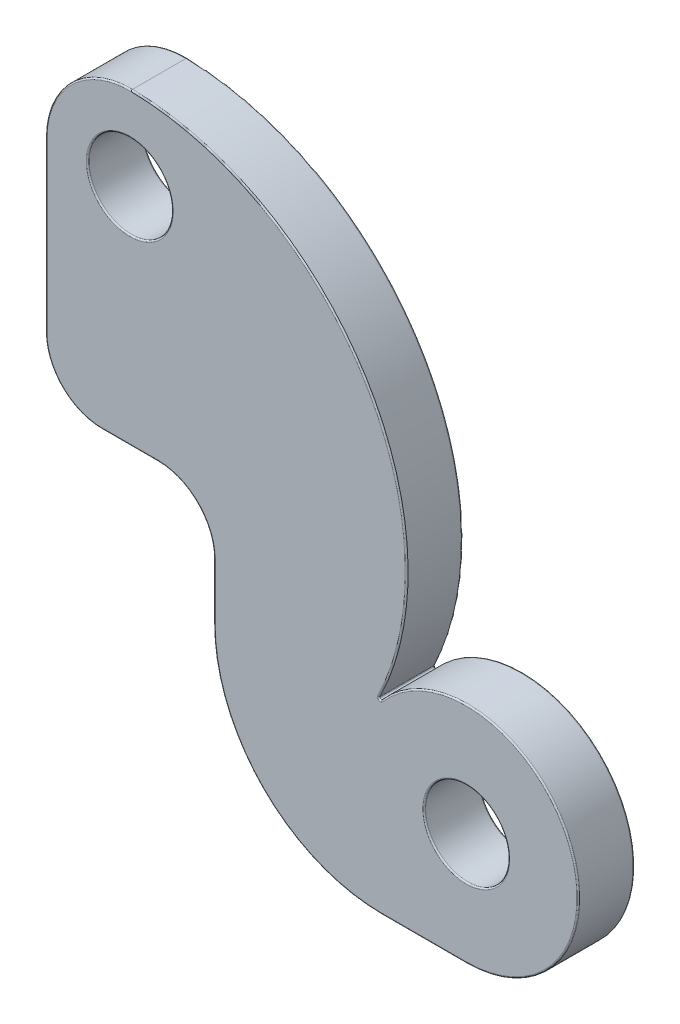
ISO-10303-21;
HEADER;
FILE_DESCRIPTION(('STEP AP214'),'2;1');
FILE_NAME('part.step','',(''),(''),'','','');
FILE_SCHEMA(('AUTOMOTIVE_DESIGN { 1 0 10303 214 1 1 1 1 }'));
ENDSEC;
DATA;
#1=APPLICATION_CONTEXT('core data for automotive mechanical design processes');
#2=APPLICATION_PROTOCOL_DEFINITION('international standard','automotive_design',2000,#1);
#3=PRODUCT_CONTEXT('',#1,'mechanical');
#4=PRODUCT('Part','Part','',(#3));
#5=PRODUCT_RELATED_PRODUCT_CATEGORY('part','',(#4));
#6=PRODUCT_DEFINITION_FORMATION('','',#4);
#7=PRODUCT_DEFINITION_CONTEXT('part definition',#1,'design');
#8=PRODUCT_DEFINITION('design','',#6,#7);
#9=PRODUCT_DEFINITION_SHAPE('','',#8);
#10=(LENGTH_UNIT() NAMED_UNIT(*) SI_UNIT(.MILLI.,.METRE.));
#11=(NAMED_UNIT(*) PLANE_ANGLE_UNIT() SI_UNIT($,.RADIAN.));
#12=(NAMED_UNIT(*) SI_UNIT($,.STERADIAN.) SOLID_ANGLE_UNIT());
#13=UNCERTAINTY_MEASURE_WITH_UNIT(LENGTH_MEASURE(1.E-05),#10,'distance_accuracy_value','');
#14=(GEOMETRIC_REPRESENTATION_CONTEXT(3) GLOBAL_UNCERTAINTY_ASSIGNED_CONTEXT((#13)) GLOBAL_UNIT_ASSIGNED_CONTEXT((#10,
#11,#12)) REPRESENTATION_CONTEXT('',''));
#15=CARTESIAN_POINT('',(0.,0.,0.));
#16=DIRECTION('',(0.,0.,1.));
#17=DIRECTION('',(1.,0.,0.));
#18=AXIS2_PLACEMENT_3D('',#15,#16,#17);
#19=CARTESIAN_POINT('',(0.,0.,10.));
#20=DIRECTION('',(0.,0.,1.));
#21=DIRECTION('',(1.,0.,0.));
#22=AXIS2_PLACEMENT_3D('',#19,#20,#21);
#23=PLANE('',#22);
#24=CARTESIAN_POINT('',(60.,-70.,10.));
#25=DIRECTION('',(0.,0.,1.));
#26=DIRECTION('',(1.,0.,0.));
#27=AXIS2_PLACEMENT_3D('',#24,#25,#26);
#28=CIRCLE('',#27,19.75);
#29=CARTESIAN_POINT('',(60.,-89.75,10.));
#30=VERTEX_POINT('',#29);
#31=CARTESIAN_POINT('',(45.0452681085428,-57.0996707772773,10.));
#32=VERTEX_POINT('',#31);
#33=EDGE_CURVE('E282',#30,#32,#28,.T.);
#34=ORIENTED_EDGE('',*,*,#33,.T.);
#35=CARTESIAN_POINT('',(44.6666673011642,-56.7730801640438,10.));
#36=DIRECTION('',(0.,0.,1.));
#37=DIRECTION('',(1.,0.,0.));
#38=AXIS2_PLACEMENT_3D('',#35,#36,#37);
#39=CIRCLE('',#38,0.5);
#40=CARTESIAN_POINT('',(44.2160674146189,-56.5563781976351,10.));
#41=VERTEX_POINT('',#40);
#42=EDGE_CURVE('E53',#32,#41,#39,.F.);
#43=ORIENTED_EDGE('',*,*,#42,.T.);
#44=CARTESIAN_POINT('',(-0.618621296637138,-34.9945325399747,10.));
#45=DIRECTION('',(0.,0.,1.));
#46=DIRECTION('',(1.,0.,0.));
#47=AXIS2_PLACEMENT_3D('',#44,#45,#46);
#48=CIRCLE('',#47,49.75);
#49=CARTESIAN_POINT('',(0.260704689297082,14.7476958561322,10.));
#50=VERTEX_POINT('',#49);
#51=EDGE_CURVE('E285',#41,#50,#48,.T.);
#52=ORIENTED_EDGE('',*,*,#51,.T.);
#53=CARTESIAN_POINT('',(0.,0.,10.));
#54=DIRECTION('',(0.,0.,1.));
#55=DIRECTION('',(1.,0.,0.));
#56=AXIS2_PLACEMENT_3D('',#53,#54,#55);
#57=CIRCLE('',#56,14.75);
#58=CARTESIAN_POINT('',(-14.75,0.,10.));
#59=VERTEX_POINT('',#58);
#60=EDGE_CURVE('E223',#50,#59,#57,.T.);
#61=ORIENTED_EDGE('',*,*,#60,.T.);
#62=DIRECTION('',(0.,-1.,0.));
#63=VECTOR('',#62,1.);
#64=CARTESIAN_POINT('',(-14.75,-29.9999999999999,10.));
#65=LINE('',#64,#63);
#66=CARTESIAN_POINT('',(-14.75,-29.9999999999999,10.));
#67=VERTEX_POINT('',#66);
#68=EDGE_CURVE('E261',#59,#67,#65,.T.);
#69=ORIENTED_EDGE('',*,*,#68,.T.);
#70=CARTESIAN_POINT('',(-5.,-30.,10.));
#71=DIRECTION('',(0.,0.,1.));
#72=DIRECTION('',(1.,0.,0.));
#73=AXIS2_PLACEMENT_3D('',#70,#71,#72);
#74=CIRCLE('',#73,9.74999999999999);
#75=CARTESIAN_POINT('',(-4.99999999999993,-39.75,10.));
#76=VERTEX_POINT('',#75);
#77=EDGE_CURVE('E264',#67,#76,#74,.T.);
#78=ORIENTED_EDGE('',*,*,#77,.T.);
#79=DIRECTION('',(1.,0.,0.));
#80=VECTOR('',#79,1.);
#81=CARTESIAN_POINT('',(4.99999999999994,-39.75,10.));
#82=LINE('',#81,#80);
#83=CARTESIAN_POINT('',(4.99999999999994,-39.75,10.));
#84=VERTEX_POINT('',#83);
#85=EDGE_CURVE('E267',#76,#84,#82,.T.);
#86=ORIENTED_EDGE('',*,*,#85,.T.);
#87=CARTESIAN_POINT('',(5.00000000000001,-50.,10.));
#88=DIRECTION('',(0.,0.,1.));
#89=DIRECTION('',(1.,0.,0.));
#90=AXIS2_PLACEMENT_3D('',#87,#88,#89);
#91=CIRCLE('',#90,10.25);
#92=CARTESIAN_POINT('',(15.25,-50.0000000000001,10.));
#93=VERTEX_POINT('',#92);
#94=EDGE_CURVE('E270',#84,#93,#91,.F.);
#95=ORIENTED_EDGE('',*,*,#94,.T.);
#96=DIRECTION('',(0.,-1.,0.));
#97=VECTOR('',#96,1.);
#98=CARTESIAN_POINT('',(15.25,-59.9999999999998,10.));
#99=LINE('',#98,#97);
#100=CARTESIAN_POINT('',(15.25,-59.9999999999998,10.));
#101=VERTEX_POINT('',#100);
#102=EDGE_CURVE('E273',#93,#101,#99,.T.);
#103=ORIENTED_EDGE('',*,*,#102,.T.);
#104=CARTESIAN_POINT('',(45.,-60.,10.));
#105=DIRECTION('',(0.,0.,1.));
#106=DIRECTION('',(1.,0.,0.));
#107=AXIS2_PLACEMENT_3D('',#104,#105,#106);
#108=CIRCLE('',#107,29.75);
#109=CARTESIAN_POINT('',(45.0000000000002,-89.75,10.));
#110=VERTEX_POINT('',#109);
#111=EDGE_CURVE('E276',#101,#110,#108,.T.);
#112=ORIENTED_EDGE('',*,*,#111,.T.);
#113=DIRECTION('',(1.,0.,0.));
#114=VECTOR('',#113,1.);
#115=CARTESIAN_POINT('',(60.,-89.75,10.));
#116=LINE('',#115,#114);
#117=EDGE_CURVE('E279',#110,#30,#116,.T.);
#118=ORIENTED_EDGE('',*,*,#117,.T.);
#119=EDGE_LOOP('',(#34,#43,#52,#61,#69,#78,#86,#95,#103,#112,#118));
#120=FACE_BOUND('',#119,.T.);
#121=CARTESIAN_POINT('',(0.,0.,10.));
#122=DIRECTION('',(0.,0.,1.));
#123=DIRECTION('',(1.,0.,0.));
#124=AXIS2_PLACEMENT_3D('',#121,#122,#123);
#125=CIRCLE('',#124,7.75);
#126=CARTESIAN_POINT('',(7.75,0.,10.));
#127=VERTEX_POINT('',#126);
#128=EDGE_CURVE('E255',#127,#127,#125,.F.);
#129=ORIENTED_EDGE('',*,*,#128,.T.);
#130=EDGE_LOOP('',(#129));
#131=FACE_BOUND('',#130,.T.);
#132=CARTESIAN_POINT('',(60.,-70.,10.));
#133=DIRECTION('',(0.,0.,1.));
#134=DIRECTION('',(1.,0.,0.));
#135=AXIS2_PLACEMENT_3D('',#132,#133,#134);
#136=CIRCLE('',#135,7.75);
#137=CARTESIAN_POINT('',(67.75,-70.,10.));
#138=VERTEX_POINT('',#137);
#139=EDGE_CURVE('E251',#138,#138,#136,.F.);
#140=ORIENTED_EDGE('',*,*,#139,.T.);
#141=EDGE_LOOP('',(#140));
#142=FACE_BOUND('',#141,.T.);
#143=ADVANCED_FACE('F43',(#120,#131,#142),#23,.T.);
#144=CARTESIAN_POINT('',(0.,0.,0.));
#145=DIRECTION('',(0.,0.,1.));
#146=DIRECTION('',(1.,0.,0.));
#147=AXIS2_PLACEMENT_3D('',#144,#145,#146);
#148=PLANE('',#147);
#149=CARTESIAN_POINT('',(-0.618621296637138,-34.9945325399747,0.));
#150=DIRECTION('',(0.,0.,1.));
#151=DIRECTION('',(1.,0.,0.));
#152=AXIS2_PLACEMENT_3D('',#149,#150,#151);
#153=CIRCLE('',#152,49.75);
#154=CARTESIAN_POINT('',(0.260704689297082,14.7476958561322,0.));
#155=VERTEX_POINT('',#154);
#156=CARTESIAN_POINT('',(44.2160674146189,-56.5563781976351,0.));
#157=VERTEX_POINT('',#156);
#158=EDGE_CURVE('E366',#155,#157,#153,.F.);
#159=ORIENTED_EDGE('',*,*,#158,.T.);
#160=CARTESIAN_POINT('',(44.6666673011642,-56.7730801640438,0.));
#161=DIRECTION('',(0.,0.,1.));
#162=DIRECTION('',(1.,0.,0.));
#163=AXIS2_PLACEMENT_3D('',#160,#161,#162);
#164=CIRCLE('',#163,0.5);
#165=CARTESIAN_POINT('',(45.0452681085428,-57.0996707772773,0.));
#166=VERTEX_POINT('',#165);
#167=EDGE_CURVE('E11',#157,#166,#164,.T.);
#168=ORIENTED_EDGE('',*,*,#167,.T.);
#169=CARTESIAN_POINT('',(60.,-70.,0.));
#170=DIRECTION('',(0.,0.,1.));
#171=DIRECTION('',(1.,0.,0.));
#172=AXIS2_PLACEMENT_3D('',#169,#170,#171);
#173=CIRCLE('',#172,19.75);
#174=CARTESIAN_POINT('',(60.,-89.75,0.));
#175=VERTEX_POINT('',#174);
#176=EDGE_CURVE('E363',#166,#175,#173,.F.);
#177=ORIENTED_EDGE('',*,*,#176,.T.);
#178=DIRECTION('',(1.,0.,0.));
#179=VECTOR('',#178,1.);
#180=CARTESIAN_POINT('',(0.,-89.75,0.));
#181=LINE('',#180,#179);
#182=CARTESIAN_POINT('',(45.0000000000002,-89.75,0.));
#183=VERTEX_POINT('',#182);
#184=EDGE_CURVE('E360',#175,#183,#181,.F.);
#185=ORIENTED_EDGE('',*,*,#184,.T.);
#186=CARTESIAN_POINT('',(45.,-60.,0.));
#187=DIRECTION('',(0.,0.,1.));
#188=DIRECTION('',(1.,0.,0.));
#189=AXIS2_PLACEMENT_3D('',#186,#187,#188);
#190=CIRCLE('',#189,29.75);
#191=CARTESIAN_POINT('',(15.25,-59.9999999999998,0.));
#192=VERTEX_POINT('',#191);
#193=EDGE_CURVE('E357',#183,#192,#190,.F.);
#194=ORIENTED_EDGE('',*,*,#193,.T.);
#195=DIRECTION('',(0.,-1.,0.));
#196=VECTOR('',#195,1.);
#197=CARTESIAN_POINT('',(15.25,0.,0.));
#198=LINE('',#197,#196);
#199=CARTESIAN_POINT('',(15.25,-50.0000000000001,0.));
#200=VERTEX_POINT('',#199);
#201=EDGE_CURVE('E354',#192,#200,#198,.F.);
#202=ORIENTED_EDGE('',*,*,#201,.T.);
#203=CARTESIAN_POINT('',(5.00000000000001,-50.,0.));
#204=DIRECTION('',(0.,0.,1.));
#205=DIRECTION('',(1.,0.,0.));
#206=AXIS2_PLACEMENT_3D('',#203,#204,#205);
#207=CIRCLE('',#206,10.25);
#208=CARTESIAN_POINT('',(4.99999999999994,-39.75,0.));
#209=VERTEX_POINT('',#208);
#210=EDGE_CURVE('E351',#200,#209,#207,.T.);
#211=ORIENTED_EDGE('',*,*,#210,.T.);
#212=DIRECTION('',(1.,0.,0.));
#213=VECTOR('',#212,1.);
#214=CARTESIAN_POINT('',(0.,-39.75,0.));
#215=LINE('',#214,#213);
#216=CARTESIAN_POINT('',(-4.99999999999993,-39.75,0.));
#217=VERTEX_POINT('',#216);
#218=EDGE_CURVE('E348',#209,#217,#215,.F.);
#219=ORIENTED_EDGE('',*,*,#218,.T.);
#220=CARTESIAN_POINT('',(-5.,-30.,0.));
#221=DIRECTION('',(0.,0.,1.));
#222=DIRECTION('',(1.,0.,0.));
#223=AXIS2_PLACEMENT_3D('',#220,#221,#222);
#224=CIRCLE('',#223,9.74999999999999);
#225=CARTESIAN_POINT('',(-14.75,-29.9999999999999,0.));
#226=VERTEX_POINT('',#225);
#227=EDGE_CURVE('E345',#217,#226,#224,.F.);
#228=ORIENTED_EDGE('',*,*,#227,.T.);
#229=DIRECTION('',(0.,-1.,0.));
#230=VECTOR('',#229,1.);
#231=CARTESIAN_POINT('',(-14.75,0.,0.));
#232=LINE('',#231,#230);
#233=CARTESIAN_POINT('',(-14.75,0.,0.));
#234=VERTEX_POINT('',#233);
#235=EDGE_CURVE('E342',#226,#234,#232,.F.);
#236=ORIENTED_EDGE('',*,*,#235,.T.);
#237=CARTESIAN_POINT('',(0.,0.,0.));
#238=DIRECTION('',(0.,0.,1.));
#239=DIRECTION('',(1.,0.,0.));
#240=AXIS2_PLACEMENT_3D('',#237,#238,#239);
#241=CIRCLE('',#240,14.75);
#242=EDGE_CURVE('E339',#234,#155,#241,.F.);
#243=ORIENTED_EDGE('',*,*,#242,.T.);
#244=EDGE_LOOP('',(#159,#168,#177,#185,#194,#202,#211,#219,#228,#236,#243));
#245=FACE_BOUND('',#244,.T.);
#246=CARTESIAN_POINT('',(0.,0.,0.));
#247=DIRECTION('',(0.,0.,1.));
#248=DIRECTION('',(1.,0.,0.));
#249=AXIS2_PLACEMENT_3D('',#246,#247,#248);
#250=CIRCLE('',#249,7.75);
#251=CARTESIAN_POINT('',(7.75,0.,0.));
#252=VERTEX_POINT('',#251);
#253=EDGE_CURVE('E335',#252,#252,#250,.T.);
#254=ORIENTED_EDGE('',*,*,#253,.T.);
#255=EDGE_LOOP('',(#254));
#256=FACE_BOUND('',#255,.T.);
#257=CARTESIAN_POINT('',(60.,-70.,0.));
#258=DIRECTION('',(0.,0.,1.));
#259=DIRECTION('',(1.,0.,0.));
#260=AXIS2_PLACEMENT_3D('',#257,#258,#259);
#261=CIRCLE('',#260,7.75);
#262=CARTESIAN_POINT('',(67.75,-70.,0.));
#263=VERTEX_POINT('',#262);
#264=EDGE_CURVE('E206',#263,#263,#261,.T.);
#265=ORIENTED_EDGE('',*,*,#264,.T.);
#266=EDGE_LOOP('',(#265));
#267=FACE_BOUND('',#266,.T.);
#268=ADVANCED_FACE('F614',(#245,#256,#267),#148,.F.);
#269=CARTESIAN_POINT('',(0.,0.,10.));
#270=DIRECTION('',(0.,0.,-1.));
#271=DIRECTION('',(-1.,0.,0.));
#272=AXIS2_PLACEMENT_3D('',#269,#270,#271);
#273=CYLINDRICAL_SURFACE('',#272,15.);
#274=DIRECTION('',(0.,0.,-1.));
#275=VECTOR('',#274,1.);
#276=CARTESIAN_POINT('',(-15.,0.,10.));
#277=LINE('',#276,#275);
#278=CARTESIAN_POINT('',(-15.,0.,9.75));
#279=VERTEX_POINT('',#278);
#280=CARTESIAN_POINT('',(-15.,0.,0.25));
#281=VERTEX_POINT('',#280);
#282=EDGE_CURVE('E200',#279,#281,#277,.T.);
#283=ORIENTED_EDGE('',*,*,#282,.F.);
#284=CARTESIAN_POINT('',(0.,0.,9.75));
#285=DIRECTION('',(0.,0.,1.));
#286=DIRECTION('',(1.,0.,0.));
#287=AXIS2_PLACEMENT_3D('',#284,#285,#286);
#288=CIRCLE('',#287,15.);
#289=CARTESIAN_POINT('',(0.26512341284449,14.9976568028463,9.75));
#290=VERTEX_POINT('',#289);
#291=EDGE_CURVE('E194',#279,#290,#288,.F.);
#292=ORIENTED_EDGE('',*,*,#291,.T.);
#293=DIRECTION('',(0.,0.,-1.));
#294=VECTOR('',#293,1.);
#295=CARTESIAN_POINT('',(0.26512341284449,14.9976568028463,10.));
#296=LINE('',#295,#294);
#297=CARTESIAN_POINT('',(0.26512341284449,14.9976568028463,0.25));
#298=VERTEX_POINT('',#297);
#299=EDGE_CURVE('E197',#290,#298,#296,.T.);
#300=ORIENTED_EDGE('',*,*,#299,.T.);
#301=CARTESIAN_POINT('',(0.,0.,0.25));
#302=DIRECTION('',(0.,0.,1.));
#303=DIRECTION('',(1.,0.,0.));
#304=AXIS2_PLACEMENT_3D('',#301,#302,#303);
#305=CIRCLE('',#304,15.);
#306=EDGE_CURVE('E207',#298,#281,#305,.T.);
#307=ORIENTED_EDGE('',*,*,#306,.T.);
#308=EDGE_LOOP('',(#283,#292,#300,#307));
#309=FACE_BOUND('',#308,.T.);
#310=ADVANCED_FACE('F196',(#309),#273,.T.);
#311=CARTESIAN_POINT('',(-15.,0.,10.));
#312=DIRECTION('',(1.,0.,0.));
#313=DIRECTION('',(0.,1.,0.));
#314=AXIS2_PLACEMENT_3D('',#311,#312,#313);
#315=PLANE('',#314);
#316=DIRECTION('',(0.,0.,-1.));
#317=VECTOR('',#316,1.);
#318=CARTESIAN_POINT('',(-15.,-29.9999999999999,10.));
#319=LINE('',#318,#317);
#320=CARTESIAN_POINT('',(-15.,-29.9999999999999,9.75));
#321=VERTEX_POINT('',#320);
#322=CARTESIAN_POINT('',(-15.,-29.9999999999999,0.25));
#323=VERTEX_POINT('',#322);
#324=EDGE_CURVE('E500',#321,#323,#319,.T.);
#325=ORIENTED_EDGE('',*,*,#324,.F.);
#326=DIRECTION('',(0.,-1.,0.));
#327=VECTOR('',#326,1.);
#328=CARTESIAN_POINT('',(-15.,0.,9.75));
#329=LINE('',#328,#327);
#330=EDGE_CURVE('E327',#321,#279,#329,.F.);
#331=ORIENTED_EDGE('',*,*,#330,.T.);
#332=ORIENTED_EDGE('',*,*,#282,.T.);
#333=DIRECTION('',(0.,-1.,0.));
#334=VECTOR('',#333,1.);
#335=CARTESIAN_POINT('',(-15.,0.,0.25));
#336=LINE('',#335,#334);
#337=EDGE_CURVE('E324',#281,#323,#336,.T.);
#338=ORIENTED_EDGE('',*,*,#337,.T.);
#339=EDGE_LOOP('',(#325,#331,#332,#338));
#340=FACE_BOUND('',#339,.T.);
#341=ADVANCED_FACE('F497',(#340),#315,.F.);
#342=CARTESIAN_POINT('',(-5.,-30.,10.));
#343=DIRECTION('',(0.,0.,-1.));
#344=DIRECTION('',(-1.,0.,0.));
#345=AXIS2_PLACEMENT_3D('',#342,#343,#344);
#346=CYLINDRICAL_SURFACE('',#345,9.99999999999999);
#347=DIRECTION('',(0.,0.,-1.));
#348=VECTOR('',#347,1.);
#349=CARTESIAN_POINT('',(-4.99999999999993,-40.,10.));
#350=LINE('',#349,#348);
#351=CARTESIAN_POINT('',(-4.99999999999993,-40.,9.75));
#352=VERTEX_POINT('',#351);
#353=CARTESIAN_POINT('',(-4.99999999999993,-40.,0.25));
#354=VERTEX_POINT('',#353);
#355=EDGE_CURVE('E504',#352,#354,#350,.T.);
#356=ORIENTED_EDGE('',*,*,#355,.F.);
#357=CARTESIAN_POINT('',(-5.,-30.,9.75));
#358=DIRECTION('',(0.,0.,1.));
#359=DIRECTION('',(1.,0.,0.));
#360=AXIS2_PLACEMENT_3D('',#357,#358,#359);
#361=CIRCLE('',#360,9.99999999999999);
#362=EDGE_CURVE('E321',#352,#321,#361,.F.);
#363=ORIENTED_EDGE('',*,*,#362,.T.);
#364=ORIENTED_EDGE('',*,*,#324,.T.);
#365=CARTESIAN_POINT('',(-5.,-30.,0.25));
#366=DIRECTION('',(0.,0.,1.));
#367=DIRECTION('',(1.,0.,0.));
#368=AXIS2_PLACEMENT_3D('',#365,#366,#367);
#369=CIRCLE('',#368,9.99999999999999);
#370=EDGE_CURVE('E318',#323,#354,#369,.T.);
#371=ORIENTED_EDGE('',*,*,#370,.T.);
#372=EDGE_LOOP('',(#356,#363,#364,#371));
#373=FACE_BOUND('',#372,.T.);
#374=ADVANCED_FACE('F569',(#373),#346,.T.);
#375=CARTESIAN_POINT('',(-4.99999999999993,-40.,10.));
#376=DIRECTION('',(0.,1.,0.));
#377=DIRECTION('',(0.,0.,1.));
#378=AXIS2_PLACEMENT_3D('',#375,#376,#377);
#379=PLANE('',#378);
#380=DIRECTION('',(0.,0.,-1.));
#381=VECTOR('',#380,1.);
#382=CARTESIAN_POINT('',(4.99999999999994,-40.,10.));
#383=LINE('',#382,#381);
#384=CARTESIAN_POINT('',(4.99999999999994,-40.,9.75));
#385=VERTEX_POINT('',#384);
#386=CARTESIAN_POINT('',(4.99999999999994,-40.,0.25));
#387=VERTEX_POINT('',#386);
#388=EDGE_CURVE('E510',#385,#387,#383,.T.);
#389=ORIENTED_EDGE('',*,*,#388,.F.);
#390=DIRECTION('',(1.,0.,0.));
#391=VECTOR('',#390,1.);
#392=CARTESIAN_POINT('',(-4.99999999999993,-40.,9.75));
#393=LINE('',#392,#391);
#394=EDGE_CURVE('E315',#385,#352,#393,.F.);
#395=ORIENTED_EDGE('',*,*,#394,.T.);
#396=ORIENTED_EDGE('',*,*,#355,.T.);
#397=DIRECTION('',(1.,0.,0.));
#398=VECTOR('',#397,1.);
#399=CARTESIAN_POINT('',(-4.99999999999993,-40.,0.25));
#400=LINE('',#399,#398);
#401=EDGE_CURVE('E312',#354,#387,#400,.T.);
#402=ORIENTED_EDGE('',*,*,#401,.T.);
#403=EDGE_LOOP('',(#389,#395,#396,#402));
#404=FACE_BOUND('',#403,.T.);
#405=ADVANCED_FACE('F573',(#404),#379,.F.);
#406=CARTESIAN_POINT('',(5.00000000000001,-50.,10.));
#407=DIRECTION('',(0.,0.,-1.));
#408=DIRECTION('',(-1.,0.,0.));
#409=AXIS2_PLACEMENT_3D('',#406,#407,#408);
#410=CYLINDRICAL_SURFACE('',#409,9.99999999999999);
#411=DIRECTION('',(0.,0.,-1.));
#412=VECTOR('',#411,1.);
#413=CARTESIAN_POINT('',(15.,-50.0000000000001,10.));
#414=LINE('',#413,#412);
#415=CARTESIAN_POINT('',(15.,-50.0000000000001,9.75));
#416=VERTEX_POINT('',#415);
#417=CARTESIAN_POINT('',(15.,-50.0000000000001,0.25));
#418=VERTEX_POINT('',#417);
#419=EDGE_CURVE('E517',#416,#418,#414,.T.);
#420=ORIENTED_EDGE('',*,*,#419,.F.);
#421=CARTESIAN_POINT('',(5.00000000000001,-50.,9.75));
#422=DIRECTION('',(0.,0.,1.));
#423=DIRECTION('',(1.,0.,0.));
#424=AXIS2_PLACEMENT_3D('',#421,#422,#423);
#425=CIRCLE('',#424,9.99999999999999);
#426=EDGE_CURVE('E309',#416,#385,#425,.T.);
#427=ORIENTED_EDGE('',*,*,#426,.T.);
#428=ORIENTED_EDGE('',*,*,#388,.T.);
#429=CARTESIAN_POINT('',(5.00000000000001,-50.,0.25));
#430=DIRECTION('',(0.,0.,1.));
#431=DIRECTION('',(1.,0.,0.));
#432=AXIS2_PLACEMENT_3D('',#429,#430,#431);
#433=CIRCLE('',#432,9.99999999999999);
#434=EDGE_CURVE('E306',#387,#418,#433,.F.);
#435=ORIENTED_EDGE('',*,*,#434,.T.);
#436=EDGE_LOOP('',(#420,#427,#428,#435));
#437=FACE_BOUND('',#436,.T.);
#438=ADVANCED_FACE('F582',(#437),#410,.F.);
#439=CARTESIAN_POINT('',(15.,-50.0000000000001,10.));
#440=DIRECTION('',(1.,0.,0.));
#441=DIRECTION('',(0.,1.,0.));
#442=AXIS2_PLACEMENT_3D('',#439,#440,#441);
#443=PLANE('',#442);
#444=DIRECTION('',(0.,0.,-1.));
#445=VECTOR('',#444,1.);
#446=CARTESIAN_POINT('',(15.,-59.9999999999998,10.));
#447=LINE('',#446,#445);
#448=CARTESIAN_POINT('',(15.,-59.9999999999998,9.75));
#449=VERTEX_POINT('',#448);
#450=CARTESIAN_POINT('',(15.,-59.9999999999998,0.25));
#451=VERTEX_POINT('',#450);
#452=EDGE_CURVE('E521',#449,#451,#447,.T.);
#453=ORIENTED_EDGE('',*,*,#452,.F.);
#454=DIRECTION('',(0.,-1.,0.));
#455=VECTOR('',#454,1.);
#456=CARTESIAN_POINT('',(15.,-50.0000000000001,9.75));
#457=LINE('',#456,#455);
#458=EDGE_CURVE('E303',#449,#416,#457,.F.);
#459=ORIENTED_EDGE('',*,*,#458,.T.);
#460=ORIENTED_EDGE('',*,*,#419,.T.);
#461=DIRECTION('',(0.,-1.,0.));
#462=VECTOR('',#461,1.);
#463=CARTESIAN_POINT('',(15.,-50.0000000000001,0.25));
#464=LINE('',#463,#462);
#465=EDGE_CURVE('E300',#418,#451,#464,.T.);
#466=ORIENTED_EDGE('',*,*,#465,.T.);
#467=EDGE_LOOP('',(#453,#459,#460,#466));
#468=FACE_BOUND('',#467,.T.);
#469=ADVANCED_FACE('F585',(#468),#443,.F.);
#470=CARTESIAN_POINT('',(45.,-60.,10.));
#471=DIRECTION('',(0.,0.,-1.));
#472=DIRECTION('',(-1.,0.,0.));
#473=AXIS2_PLACEMENT_3D('',#470,#471,#472);
#474=CYLINDRICAL_SURFACE('',#473,30.);
#475=DIRECTION('',(0.,0.,-1.));
#476=VECTOR('',#475,1.);
#477=CARTESIAN_POINT('',(45.0000000000002,-90.,10.));
#478=LINE('',#477,#476);
#479=CARTESIAN_POINT('',(45.0000000000002,-90.,9.75));
#480=VERTEX_POINT('',#479);
#481=CARTESIAN_POINT('',(45.0000000000002,-90.,0.25));
#482=VERTEX_POINT('',#481);
#483=EDGE_CURVE('E525',#480,#482,#478,.T.);
#484=ORIENTED_EDGE('',*,*,#483,.F.);
#485=CARTESIAN_POINT('',(45.,-60.,9.75));
#486=DIRECTION('',(0.,0.,1.));
#487=DIRECTION('',(1.,0.,0.));
#488=AXIS2_PLACEMENT_3D('',#485,#486,#487);
#489=CIRCLE('',#488,30.);
#490=EDGE_CURVE('E297',#480,#449,#489,.F.);
#491=ORIENTED_EDGE('',*,*,#490,.T.);
#492=ORIENTED_EDGE('',*,*,#452,.T.);
#493=CARTESIAN_POINT('',(45.,-60.,0.25));
#494=DIRECTION('',(0.,0.,1.));
#495=DIRECTION('',(1.,0.,0.));
#496=AXIS2_PLACEMENT_3D('',#493,#494,#495);
#497=CIRCLE('',#496,30.);
#498=EDGE_CURVE('E294',#451,#482,#497,.T.);
#499=ORIENTED_EDGE('',*,*,#498,.T.);
#500=EDGE_LOOP('',(#484,#491,#492,#499));
#501=FACE_BOUND('',#500,.T.);
#502=ADVANCED_FACE('F631',(#501),#474,.T.);
#503=CARTESIAN_POINT('',(45.0000000000002,-90.,10.));
#504=DIRECTION('',(0.,1.,0.));
#505=DIRECTION('',(0.,0.,1.));
#506=AXIS2_PLACEMENT_3D('',#503,#504,#505);
#507=PLANE('',#506);
#508=DIRECTION('',(0.,0.,-1.));
#509=VECTOR('',#508,1.);
#510=CARTESIAN_POINT('',(60.,-90.,10.));
#511=LINE('',#510,#509);
#512=CARTESIAN_POINT('',(60.,-90.,9.75));
#513=VERTEX_POINT('',#512);
#514=CARTESIAN_POINT('',(60.,-90.,0.25));
#515=VERTEX_POINT('',#514);
#516=EDGE_CURVE('E218',#513,#515,#511,.T.);
#517=ORIENTED_EDGE('',*,*,#516,.F.);
#518=DIRECTION('',(1.,0.,0.));
#519=VECTOR('',#518,1.);
#520=CARTESIAN_POINT('',(45.0000000000002,-90.,9.75));
#521=LINE('',#520,#519);
#522=EDGE_CURVE('E291',#513,#480,#521,.F.);
#523=ORIENTED_EDGE('',*,*,#522,.T.);
#524=ORIENTED_EDGE('',*,*,#483,.T.);
#525=DIRECTION('',(1.,0.,0.));
#526=VECTOR('',#525,1.);
#527=CARTESIAN_POINT('',(45.0000000000002,-90.,0.25));
#528=LINE('',#527,#526);
#529=EDGE_CURVE('E288',#482,#515,#528,.T.);
#530=ORIENTED_EDGE('',*,*,#529,.T.);
#531=EDGE_LOOP('',(#517,#523,#524,#530));
#532=FACE_BOUND('',#531,.T.);
#533=ADVANCED_FACE('F628',(#532),#507,.F.);
#534=CARTESIAN_POINT('',(60.,-70.,10.));
#535=DIRECTION('',(0.,0.,-1.));
#536=DIRECTION('',(-1.,0.,0.));
#537=AXIS2_PLACEMENT_3D('',#534,#535,#536);
#538=CYLINDRICAL_SURFACE('',#537,20.);
#539=DIRECTION('',(0.,0.,-1.));
#540=VECTOR('',#539,1.);
#541=CARTESIAN_POINT('',(44.8559677048535,-56.9363754706605,10.));
#542=LINE('',#541,#540);
#543=CARTESIAN_POINT('',(44.8559677048535,-56.9363754706605,0.25));
#544=VERTEX_POINT('',#543);
#545=CARTESIAN_POINT('',(44.8559677048535,-56.9363754706605,9.75));
#546=VERTEX_POINT('',#545);
#547=EDGE_CURVE('E241',#544,#546,#542,.F.);
#548=ORIENTED_EDGE('',*,*,#547,.T.);
#549=CARTESIAN_POINT('',(60.,-70.,9.75));
#550=DIRECTION('',(0.,0.,1.));
#551=DIRECTION('',(1.,0.,0.));
#552=AXIS2_PLACEMENT_3D('',#549,#550,#551);
#553=CIRCLE('',#552,20.);
#554=EDGE_CURVE('E248',#546,#513,#553,.F.);
#555=ORIENTED_EDGE('',*,*,#554,.T.);
#556=ORIENTED_EDGE('',*,*,#516,.T.);
#557=CARTESIAN_POINT('',(60.,-70.,0.25));
#558=DIRECTION('',(0.,0.,1.));
#559=DIRECTION('',(1.,0.,0.));
#560=AXIS2_PLACEMENT_3D('',#557,#558,#559);
#561=CIRCLE('',#560,20.);
#562=EDGE_CURVE('E236',#515,#544,#561,.T.);
#563=ORIENTED_EDGE('',*,*,#562,.T.);
#564=EDGE_LOOP('',(#548,#555,#556,#563));
#565=FACE_BOUND('',#564,.T.);
#566=ADVANCED_FACE('F534',(#565),#538,.T.);
#567=CARTESIAN_POINT('',(-0.618621296637138,-34.9945325399747,10.));
#568=DIRECTION('',(0.,0.,-1.));
#569=DIRECTION('',(-1.,0.,0.));
#570=AXIS2_PLACEMENT_3D('',#567,#568,#569);
#571=CYLINDRICAL_SURFACE('',#570,50.);
#572=ORIENTED_EDGE('',*,*,#299,.F.);
#573=CARTESIAN_POINT('',(-0.618621296637138,-34.9945325399747,9.75));
#574=DIRECTION('',(0.,0.,1.));
#575=DIRECTION('',(1.,0.,0.));
#576=AXIS2_PLACEMENT_3D('',#573,#574,#575);
#577=CIRCLE('',#576,50.);
#578=CARTESIAN_POINT('',(44.4413673578915,-56.6647291808395,9.75));
#579=VERTEX_POINT('',#578);
#580=EDGE_CURVE('E213',#290,#579,#577,.F.);
#581=ORIENTED_EDGE('',*,*,#580,.T.);
#582=DIRECTION('',(0.,0.,-1.));
#583=VECTOR('',#582,1.);
#584=CARTESIAN_POINT('',(44.4413673578915,-56.6647291808395,10.));
#585=LINE('',#584,#583);
#586=CARTESIAN_POINT('',(44.4413673578915,-56.6647291808395,0.25));
#587=VERTEX_POINT('',#586);
#588=EDGE_CURVE('E237',#579,#587,#585,.T.);
#589=ORIENTED_EDGE('',*,*,#588,.T.);
#590=CARTESIAN_POINT('',(-0.618621296637138,-34.9945325399747,0.25));
#591=DIRECTION('',(0.,0.,1.));
#592=DIRECTION('',(1.,0.,0.));
#593=AXIS2_PLACEMENT_3D('',#590,#591,#592);
#594=CIRCLE('',#593,50.);
#595=EDGE_CURVE('E216',#587,#298,#594,.T.);
#596=ORIENTED_EDGE('',*,*,#595,.T.);
#597=EDGE_LOOP('',(#572,#581,#589,#596));
#598=FACE_BOUND('',#597,.T.);
#599=ADVANCED_FACE('F210',(#598),#571,.T.);
#600=CARTESIAN_POINT('',(0.,0.,10.));
#601=DIRECTION('',(0.,0.,-1.));
#602=DIRECTION('',(-1.,0.,0.));
#603=AXIS2_PLACEMENT_3D('',#600,#601,#602);
#604=CYLINDRICAL_SURFACE('',#603,7.5);
#605=CARTESIAN_POINT('',(0.,0.,9.75));
#606=DIRECTION('',(0.,0.,1.));
#607=DIRECTION('',(1.,0.,0.));
#608=AXIS2_PLACEMENT_3D('',#605,#606,#607);
#609=CIRCLE('',#608,7.5);
#610=CARTESIAN_POINT('',(7.5,0.,9.75));
#611=VERTEX_POINT('',#610);
#612=EDGE_CURVE('E373',#611,#611,#609,.T.);
#613=ORIENTED_EDGE('',*,*,#612,.T.);
#614=EDGE_LOOP('',(#613));
#615=FACE_BOUND('',#614,.T.);
#616=CARTESIAN_POINT('',(0.,0.,0.25));
#617=DIRECTION('',(0.,0.,1.));
#618=DIRECTION('',(1.,0.,0.));
#619=AXIS2_PLACEMENT_3D('',#616,#617,#618);
#620=CIRCLE('',#619,7.5);
#621=CARTESIAN_POINT('',(7.5,0.,0.25));
#622=VERTEX_POINT('',#621);
#623=EDGE_CURVE('E369',#622,#622,#620,.F.);
#624=ORIENTED_EDGE('',*,*,#623,.T.);
#625=EDGE_LOOP('',(#624));
#626=FACE_BOUND('',#625,.T.);
#627=ADVANCED_FACE('F621',(#615,#626),#604,.F.);
#628=CARTESIAN_POINT('',(60.,-70.,10.));
#629=DIRECTION('',(0.,0.,-1.));
#630=DIRECTION('',(-1.,0.,0.));
#631=AXIS2_PLACEMENT_3D('',#628,#629,#630);
#632=CYLINDRICAL_SURFACE('',#631,7.5);
#633=CARTESIAN_POINT('',(60.,-70.,9.75));
#634=DIRECTION('',(0.,0.,1.));
#635=DIRECTION('',(1.,0.,0.));
#636=AXIS2_PLACEMENT_3D('',#633,#634,#635);
#637=CIRCLE('',#636,7.5);
#638=CARTESIAN_POINT('',(67.5,-70.,9.75));
#639=VERTEX_POINT('',#638);
#640=EDGE_CURVE('E381',#639,#639,#637,.T.);
#641=ORIENTED_EDGE('',*,*,#640,.T.);
#642=EDGE_LOOP('',(#641));
#643=FACE_BOUND('',#642,.T.);
#644=CARTESIAN_POINT('',(60.,-70.,0.25));
#645=DIRECTION('',(0.,0.,1.));
#646=DIRECTION('',(1.,0.,0.));
#647=AXIS2_PLACEMENT_3D('',#644,#645,#646);
#648=CIRCLE('',#647,7.5);
#649=CARTESIAN_POINT('',(67.5,-70.,0.25));
#650=VERTEX_POINT('',#649);
#651=EDGE_CURVE('E377',#650,#650,#648,.F.);
#652=ORIENTED_EDGE('',*,*,#651,.T.);
#653=EDGE_LOOP('',(#652));
#654=FACE_BOUND('',#653,.T.);
#655=ADVANCED_FACE('F675',(#643,#654),#632,.F.);
#656=CARTESIAN_POINT('',(5.00000000000001,-50.,9.75));
#657=DIRECTION('',(0.,0.,1.));
#658=DIRECTION('',(1.,0.,0.));
#659=AXIS2_PLACEMENT_3D('',#656,#657,#658);
#660=TOROIDAL_SURFACE('',#659,10.25,0.25);
#661=CARTESIAN_POINT('',(15.25,-50.0000000000001,9.75));
#662=DIRECTION('',(0.,-1.,0.));
#663=DIRECTION('',(0.,0.,-1.));
#664=AXIS2_PLACEMENT_3D('',#661,#662,#663);
#665=CIRCLE('',#664,0.25);
#666=EDGE_CURVE('E459',#93,#416,#665,.T.);
#667=ORIENTED_EDGE('',*,*,#666,.F.);
#668=ORIENTED_EDGE('',*,*,#94,.F.);
#669=CARTESIAN_POINT('',(4.99999999999994,-39.75,9.75));
#670=DIRECTION('',(-1.,0.,0.));
#671=DIRECTION('',(0.,-1.,0.));
#672=AXIS2_PLACEMENT_3D('',#669,#670,#671);
#673=CIRCLE('',#672,0.25);
#674=EDGE_CURVE('E47',#385,#84,#673,.T.);
#675=ORIENTED_EDGE('',*,*,#674,.F.);
#676=ORIENTED_EDGE('',*,*,#426,.F.);
#677=EDGE_LOOP('',(#667,#668,#675,#676));
#678=FACE_BOUND('',#677,.T.);
#679=ADVANCED_FACE('F481',(#678),#660,.T.);
#680=CARTESIAN_POINT('',(0.,-39.75,9.75));
#681=DIRECTION('',(-1.,0.,0.));
#682=DIRECTION('',(0.,0.,1.));
#683=AXIS2_PLACEMENT_3D('',#680,#681,#682);
#684=CYLINDRICAL_SURFACE('',#683,0.25);
#685=ORIENTED_EDGE('',*,*,#674,.T.);
#686=ORIENTED_EDGE('',*,*,#85,.F.);
#687=CARTESIAN_POINT('',(-4.99999999999993,-39.75,9.75));
#688=DIRECTION('',(-1.,0.,0.));
#689=DIRECTION('',(0.,0.,1.));
#690=AXIS2_PLACEMENT_3D('',#687,#688,#689);
#691=CIRCLE('',#690,0.25);
#692=EDGE_CURVE('E455',#352,#76,#691,.T.);
#693=ORIENTED_EDGE('',*,*,#692,.F.);
#694=ORIENTED_EDGE('',*,*,#394,.F.);
#695=EDGE_LOOP('',(#685,#686,#693,#694));
#696=FACE_BOUND('',#695,.T.);
#697=ADVANCED_FACE('F475',(#696),#684,.T.);
#698=CARTESIAN_POINT('',(-4.99999999999993,-39.75,0.25));
#699=DIRECTION('',(1.,0.,0.));
#700=DIRECTION('',(0.,0.,-1.));
#701=AXIS2_PLACEMENT_3D('',#698,#699,#700);
#702=CYLINDRICAL_SURFACE('',#701,0.25);
#703=CARTESIAN_POINT('',(-4.99999999999993,-39.75,0.25));
#704=DIRECTION('',(-1.,0.,0.));
#705=DIRECTION('',(0.,0.,1.));
#706=AXIS2_PLACEMENT_3D('',#703,#704,#705);
#707=CIRCLE('',#706,0.25);
#708=EDGE_CURVE('E451',#217,#354,#707,.T.);
#709=ORIENTED_EDGE('',*,*,#708,.F.);
#710=ORIENTED_EDGE('',*,*,#218,.F.);
#711=CARTESIAN_POINT('',(4.99999999999994,-39.75,0.25));
#712=DIRECTION('',(1.,0.,0.));
#713=DIRECTION('',(0.,0.,-1.));
#714=AXIS2_PLACEMENT_3D('',#711,#712,#713);
#715=CIRCLE('',#714,0.25);
#716=EDGE_CURVE('E462',#387,#209,#715,.T.);
#717=ORIENTED_EDGE('',*,*,#716,.F.);
#718=ORIENTED_EDGE('',*,*,#401,.F.);
#719=EDGE_LOOP('',(#709,#710,#717,#718));
#720=FACE_BOUND('',#719,.T.);
#721=ADVANCED_FACE('F575',(#720),#702,.T.);
#722=CARTESIAN_POINT('',(5.00000000000001,-50.,0.25));
#723=DIRECTION('',(0.,0.,1.));
#724=DIRECTION('',(1.,0.,0.));
#725=AXIS2_PLACEMENT_3D('',#722,#723,#724);
#726=TOROIDAL_SURFACE('',#725,10.25,0.25);
#727=ORIENTED_EDGE('',*,*,#716,.T.);
#728=ORIENTED_EDGE('',*,*,#210,.F.);
#729=CARTESIAN_POINT('',(15.25,-50.0000000000001,0.25));
#730=DIRECTION('',(0.,-1.,0.));
#731=DIRECTION('',(0.,0.,-1.));
#732=AXIS2_PLACEMENT_3D('',#729,#730,#731);
#733=CIRCLE('',#732,0.25);
#734=EDGE_CURVE('E447',#418,#200,#733,.T.);
#735=ORIENTED_EDGE('',*,*,#734,.F.);
#736=ORIENTED_EDGE('',*,*,#434,.F.);
#737=EDGE_LOOP('',(#727,#728,#735,#736));
#738=FACE_BOUND('',#737,.T.);
#739=ADVANCED_FACE('F578',(#738),#726,.T.);
#740=CARTESIAN_POINT('',(15.25,0.,9.75));
#741=DIRECTION('',(0.,1.,0.));
#742=DIRECTION('',(-1.,0.,0.));
#743=AXIS2_PLACEMENT_3D('',#740,#741,#742);
#744=CYLINDRICAL_SURFACE('',#743,0.25);
#745=ORIENTED_EDGE('',*,*,#666,.T.);
#746=ORIENTED_EDGE('',*,*,#458,.F.);
#747=CARTESIAN_POINT('',(15.25,-59.9999999999998,9.75));
#748=DIRECTION('',(0.,-1.,0.));
#749=DIRECTION('',(0.,0.,-1.));
#750=AXIS2_PLACEMENT_3D('',#747,#748,#749);
#751=CIRCLE('',#750,0.25);
#752=EDGE_CURVE('E443',#101,#449,#751,.T.);
#753=ORIENTED_EDGE('',*,*,#752,.F.);
#754=ORIENTED_EDGE('',*,*,#102,.F.);
#755=EDGE_LOOP('',(#745,#746,#753,#754));
#756=FACE_BOUND('',#755,.T.);
#757=ADVANCED_FACE('F588',(#756),#744,.T.);
#758=CARTESIAN_POINT('',(-5.,-30.,9.75));
#759=DIRECTION('',(0.,0.,1.));
#760=DIRECTION('',(1.,0.,0.));
#761=AXIS2_PLACEMENT_3D('',#758,#759,#760);
#762=TOROIDAL_SURFACE('',#761,9.74999999999999,0.25);
#763=ORIENTED_EDGE('',*,*,#692,.T.);
#764=ORIENTED_EDGE('',*,*,#77,.F.);
#765=CARTESIAN_POINT('',(-14.75,-29.9999999999999,9.75));
#766=DIRECTION('',(0.,1.,0.));
#767=DIRECTION('',(-1.,0.,0.));
#768=AXIS2_PLACEMENT_3D('',#765,#766,#767);
#769=CIRCLE('',#768,0.25);
#770=EDGE_CURVE('E439',#321,#67,#769,.T.);
#771=ORIENTED_EDGE('',*,*,#770,.F.);
#772=ORIENTED_EDGE('',*,*,#362,.F.);
#773=EDGE_LOOP('',(#763,#764,#771,#772));
#774=FACE_BOUND('',#773,.T.);
#775=ADVANCED_FACE('F490',(#774),#762,.T.);
#776=CARTESIAN_POINT('',(-5.,-30.,0.25));
#777=DIRECTION('',(0.,0.,1.));
#778=DIRECTION('',(1.,0.,0.));
#779=AXIS2_PLACEMENT_3D('',#776,#777,#778);
#780=TOROIDAL_SURFACE('',#779,9.74999999999999,0.25);
#781=ORIENTED_EDGE('',*,*,#708,.T.);
#782=ORIENTED_EDGE('',*,*,#370,.F.);
#783=CARTESIAN_POINT('',(-14.75,-29.9999999999999,0.25));
#784=DIRECTION('',(0.,1.,0.));
#785=DIRECTION('',(-1.,0.,0.));
#786=AXIS2_PLACEMENT_3D('',#783,#784,#785);
#787=CIRCLE('',#786,0.25);
#788=EDGE_CURVE('E435',#226,#323,#787,.T.);
#789=ORIENTED_EDGE('',*,*,#788,.F.);
#790=ORIENTED_EDGE('',*,*,#227,.F.);
#791=EDGE_LOOP('',(#781,#782,#789,#790));
#792=FACE_BOUND('',#791,.T.);
#793=ADVANCED_FACE('F566',(#792),#780,.T.);
#794=CARTESIAN_POINT('',(15.25,-50.0000000000001,0.25));
#795=DIRECTION('',(0.,-1.,0.));
#796=DIRECTION('',(1.,0.,0.));
#797=AXIS2_PLACEMENT_3D('',#794,#795,#796);
#798=CYLINDRICAL_SURFACE('',#797,0.25);
#799=ORIENTED_EDGE('',*,*,#734,.T.);
#800=ORIENTED_EDGE('',*,*,#201,.F.);
#801=CARTESIAN_POINT('',(15.25,-59.9999999999998,0.25));
#802=DIRECTION('',(0.,-1.,0.));
#803=DIRECTION('',(0.,0.,-1.));
#804=AXIS2_PLACEMENT_3D('',#801,#802,#803);
#805=CIRCLE('',#804,0.25);
#806=EDGE_CURVE('E431',#451,#192,#805,.T.);
#807=ORIENTED_EDGE('',*,*,#806,.F.);
#808=ORIENTED_EDGE('',*,*,#465,.F.);
#809=EDGE_LOOP('',(#799,#800,#807,#808));
#810=FACE_BOUND('',#809,.T.);
#811=ADVANCED_FACE('F850',(#810),#798,.T.);
#812=CARTESIAN_POINT('',(45.,-60.,9.75));
#813=DIRECTION('',(0.,0.,1.));
#814=DIRECTION('',(1.,0.,0.));
#815=AXIS2_PLACEMENT_3D('',#812,#813,#814);
#816=TOROIDAL_SURFACE('',#815,29.75,0.25);
#817=ORIENTED_EDGE('',*,*,#752,.T.);
#818=ORIENTED_EDGE('',*,*,#490,.F.);
#819=CARTESIAN_POINT('',(45.0000000000002,-89.75,9.75));
#820=DIRECTION('',(1.,0.,0.));
#821=DIRECTION('',(0.,0.,-1.));
#822=AXIS2_PLACEMENT_3D('',#819,#820,#821);
#823=CIRCLE('',#822,0.25);
#824=EDGE_CURVE('E427',#110,#480,#823,.T.);
#825=ORIENTED_EDGE('',*,*,#824,.F.);
#826=ORIENTED_EDGE('',*,*,#111,.F.);
#827=EDGE_LOOP('',(#817,#818,#825,#826));
#828=FACE_BOUND('',#827,.T.);
#829=ADVANCED_FACE('F592',(#828),#816,.T.);
#830=CARTESIAN_POINT('',(-14.75,0.,9.75));
#831=DIRECTION('',(0.,1.,0.));
#832=DIRECTION('',(-1.,0.,0.));
#833=AXIS2_PLACEMENT_3D('',#830,#831,#832);
#834=CYLINDRICAL_SURFACE('',#833,0.25);
#835=ORIENTED_EDGE('',*,*,#770,.T.);
#836=ORIENTED_EDGE('',*,*,#68,.F.);
#837=CARTESIAN_POINT('',(-14.75,0.,9.75));
#838=DIRECTION('',(0.,1.,0.));
#839=DIRECTION('',(-1.,0.,0.));
#840=AXIS2_PLACEMENT_3D('',#837,#838,#839);
#841=CIRCLE('',#840,0.25);
#842=EDGE_CURVE('E424',#279,#59,#841,.T.);
#843=ORIENTED_EDGE('',*,*,#842,.F.);
#844=ORIENTED_EDGE('',*,*,#330,.F.);
#845=EDGE_LOOP('',(#835,#836,#843,#844));
#846=FACE_BOUND('',#845,.T.);
#847=ADVANCED_FACE('F494',(#846),#834,.T.);
#848=CARTESIAN_POINT('',(-14.75,0.,0.25));
#849=DIRECTION('',(0.,-1.,0.));
#850=DIRECTION('',(1.,0.,0.));
#851=AXIS2_PLACEMENT_3D('',#848,#849,#850);
#852=CYLINDRICAL_SURFACE('',#851,0.25);
#853=ORIENTED_EDGE('',*,*,#788,.T.);
#854=ORIENTED_EDGE('',*,*,#337,.F.);
#855=CARTESIAN_POINT('',(-14.75,0.,0.25));
#856=DIRECTION('',(0.,1.,0.));
#857=DIRECTION('',(-1.,0.,0.));
#858=AXIS2_PLACEMENT_3D('',#855,#856,#857);
#859=CIRCLE('',#858,0.25);
#860=EDGE_CURVE('E420',#234,#281,#859,.T.);
#861=ORIENTED_EDGE('',*,*,#860,.F.);
#862=ORIENTED_EDGE('',*,*,#235,.F.);
#863=EDGE_LOOP('',(#853,#854,#861,#862));
#864=FACE_BOUND('',#863,.T.);
#865=ADVANCED_FACE('F562',(#864),#852,.T.);
#866=CARTESIAN_POINT('',(45.,-60.,0.25));
#867=DIRECTION('',(0.,0.,1.));
#868=DIRECTION('',(1.,0.,0.));
#869=AXIS2_PLACEMENT_3D('',#866,#867,#868);
#870=TOROIDAL_SURFACE('',#869,29.75,0.25);
#871=ORIENTED_EDGE('',*,*,#806,.T.);
#872=ORIENTED_EDGE('',*,*,#193,.F.);
#873=CARTESIAN_POINT('',(45.0000000000002,-89.75,0.25));
#874=DIRECTION('',(1.,0.,0.));
#875=DIRECTION('',(0.,0.,-1.));
#876=AXIS2_PLACEMENT_3D('',#873,#874,#875);
#877=CIRCLE('',#876,0.25);
#878=EDGE_CURVE('E416',#482,#183,#877,.T.);
#879=ORIENTED_EDGE('',*,*,#878,.F.);
#880=ORIENTED_EDGE('',*,*,#498,.F.);
#881=EDGE_LOOP('',(#871,#872,#879,#880));
#882=FACE_BOUND('',#881,.T.);
#883=ADVANCED_FACE('F884',(#882),#870,.T.);
#884=CARTESIAN_POINT('',(0.,-89.75,9.75));
#885=DIRECTION('',(-1.,0.,0.));
#886=DIRECTION('',(0.,0.,1.));
#887=AXIS2_PLACEMENT_3D('',#884,#885,#886);
#888=CYLINDRICAL_SURFACE('',#887,0.25);
#889=ORIENTED_EDGE('',*,*,#824,.T.);
#890=ORIENTED_EDGE('',*,*,#522,.F.);
#891=CARTESIAN_POINT('',(60.,-89.75,9.75));
#892=DIRECTION('',(1.,0.,0.));
#893=DIRECTION('',(0.,0.,-1.));
#894=AXIS2_PLACEMENT_3D('',#891,#892,#893);
#895=CIRCLE('',#894,0.25);
#896=EDGE_CURVE('E228',#30,#513,#895,.T.);
#897=ORIENTED_EDGE('',*,*,#896,.F.);
#898=ORIENTED_EDGE('',*,*,#117,.F.);
#899=EDGE_LOOP('',(#889,#890,#897,#898));
#900=FACE_BOUND('',#899,.T.);
#901=ADVANCED_FACE('F599',(#900),#888,.T.);
#902=CARTESIAN_POINT('',(0.,0.,9.75));
#903=DIRECTION('',(0.,0.,1.));
#904=DIRECTION('',(1.,0.,0.));
#905=AXIS2_PLACEMENT_3D('',#902,#903,#904);
#906=TOROIDAL_SURFACE('',#905,14.75,0.25);
#907=ORIENTED_EDGE('',*,*,#842,.T.);
#908=ORIENTED_EDGE('',*,*,#60,.F.);
#909=CARTESIAN_POINT('',(0.260704689297082,14.7476958561322,9.75));
#910=DIRECTION('',(0.99984378685642,-0.0176748941896328,0.));
#911=DIRECTION('',(0.0176748941896328,0.99984378685642,0.));
#912=AXIS2_PLACEMENT_3D('',#909,#910,#911);
#913=CIRCLE('',#912,0.25);
#914=EDGE_CURVE('E221',#290,#50,#913,.T.);
#915=ORIENTED_EDGE('',*,*,#914,.F.);
#916=ORIENTED_EDGE('',*,*,#291,.F.);
#917=EDGE_LOOP('',(#907,#908,#915,#916));
#918=FACE_BOUND('',#917,.T.);
#919=ADVANCED_FACE('F222',(#918),#906,.T.);
#920=CARTESIAN_POINT('',(0.,0.,0.25));
#921=DIRECTION('',(0.,0.,1.));
#922=DIRECTION('',(1.,0.,0.));
#923=AXIS2_PLACEMENT_3D('',#920,#921,#922);
#924=TOROIDAL_SURFACE('',#923,14.75,0.25);
#925=ORIENTED_EDGE('',*,*,#860,.T.);
#926=ORIENTED_EDGE('',*,*,#306,.F.);
#927=CARTESIAN_POINT('',(0.260704689297082,14.7476958561322,0.25));
#928=DIRECTION('',(0.99984378685642,-0.0176748941896326,0.));
#929=DIRECTION('',(0.0176748941896326,0.99984378685642,0.));
#930=AXIS2_PLACEMENT_3D('',#927,#928,#929);
#931=CIRCLE('',#930,0.25);
#932=EDGE_CURVE('E229',#155,#298,#931,.T.);
#933=ORIENTED_EDGE('',*,*,#932,.F.);
#934=ORIENTED_EDGE('',*,*,#242,.F.);
#935=EDGE_LOOP('',(#925,#926,#933,#934));
#936=FACE_BOUND('',#935,.T.);
#937=ADVANCED_FACE('F558',(#936),#924,.T.);
#938=CARTESIAN_POINT('',(45.0000000000002,-89.75,0.25));
#939=DIRECTION('',(1.,0.,0.));
#940=DIRECTION('',(0.,0.,-1.));
#941=AXIS2_PLACEMENT_3D('',#938,#939,#940);
#942=CYLINDRICAL_SURFACE('',#941,0.25);
#943=ORIENTED_EDGE('',*,*,#878,.T.);
#944=ORIENTED_EDGE('',*,*,#184,.F.);
#945=CARTESIAN_POINT('',(60.,-89.75,0.25));
#946=DIRECTION('',(1.,0.,0.));
#947=DIRECTION('',(0.,0.,-1.));
#948=AXIS2_PLACEMENT_3D('',#945,#946,#947);
#949=CIRCLE('',#948,0.25);
#950=EDGE_CURVE('E406',#515,#175,#949,.T.);
#951=ORIENTED_EDGE('',*,*,#950,.F.);
#952=ORIENTED_EDGE('',*,*,#529,.F.);
#953=EDGE_LOOP('',(#943,#944,#951,#952));
#954=FACE_BOUND('',#953,.T.);
#955=ADVANCED_FACE('F543',(#954),#942,.T.);
#956=CARTESIAN_POINT('',(60.,-70.,9.75));
#957=DIRECTION('',(0.,0.,1.));
#958=DIRECTION('',(1.,0.,0.));
#959=AXIS2_PLACEMENT_3D('',#956,#957,#958);
#960=TOROIDAL_SURFACE('',#959,19.75,0.25);
#961=ORIENTED_EDGE('',*,*,#896,.T.);
#962=ORIENTED_EDGE('',*,*,#554,.F.);
#963=CARTESIAN_POINT('',(45.0452681085428,-57.0996707772773,9.75));
#964=DIRECTION('',(-0.653181226466987,-0.757201614757314,0.));
#965=DIRECTION('',(0.757201614757314,-0.653181226466987,0.));
#966=AXIS2_PLACEMENT_3D('',#963,#964,#965);
#967=CIRCLE('',#966,0.25);
#968=EDGE_CURVE('E402',#32,#546,#967,.T.);
#969=ORIENTED_EDGE('',*,*,#968,.F.);
#970=ORIENTED_EDGE('',*,*,#33,.F.);
#971=EDGE_LOOP('',(#961,#962,#969,#970));
#972=FACE_BOUND('',#971,.T.);
#973=ADVANCED_FACE('F601',(#972),#960,.T.);
#974=CARTESIAN_POINT('',(-0.618621296637138,-34.9945325399747,9.75));
#975=DIRECTION('',(0.,0.,1.));
#976=DIRECTION('',(1.,0.,0.));
#977=AXIS2_PLACEMENT_3D('',#974,#975,#976);
#978=TOROIDAL_SURFACE('',#977,49.75,0.25);
#979=ORIENTED_EDGE('',*,*,#914,.T.);
#980=ORIENTED_EDGE('',*,*,#51,.F.);
#981=CARTESIAN_POINT('',(44.2160674146189,-56.5563781976351,9.75));
#982=DIRECTION('',(-0.433403932817291,-0.901199773090576,0.));
#983=DIRECTION('',(0.901199773090576,-0.433403932817291,0.));
#984=AXIS2_PLACEMENT_3D('',#981,#982,#983);
#985=CIRCLE('',#984,0.25);
#986=EDGE_CURVE('E233',#579,#41,#985,.T.);
#987=ORIENTED_EDGE('',*,*,#986,.F.);
#988=ORIENTED_EDGE('',*,*,#580,.F.);
#989=EDGE_LOOP('',(#979,#980,#987,#988));
#990=FACE_BOUND('',#989,.T.);
#991=ADVANCED_FACE('F231',(#990),#978,.T.);
#992=CARTESIAN_POINT('',(-0.618621296637138,-34.9945325399747,0.25));
#993=DIRECTION('',(0.,0.,1.));
#994=DIRECTION('',(1.,0.,0.));
#995=AXIS2_PLACEMENT_3D('',#992,#993,#994);
#996=TOROIDAL_SURFACE('',#995,49.75,0.25);
#997=ORIENTED_EDGE('',*,*,#932,.T.);
#998=ORIENTED_EDGE('',*,*,#595,.F.);
#999=CARTESIAN_POINT('',(44.2160674146189,-56.5563781976351,0.25));
#1000=DIRECTION('',(-0.433403932817291,-0.901199773090576,0.));
#1001=DIRECTION('',(0.901199773090576,-0.433403932817291,0.));
#1002=AXIS2_PLACEMENT_3D('',#999,#1000,#1001);
#1003=CIRCLE('',#1002,0.25);
#1004=EDGE_CURVE('E397',#157,#587,#1003,.T.);
#1005=ORIENTED_EDGE('',*,*,#1004,.F.);
#1006=ORIENTED_EDGE('',*,*,#158,.F.);
#1007=EDGE_LOOP('',(#997,#998,#1005,#1006));
#1008=FACE_BOUND('',#1007,.T.);
#1009=ADVANCED_FACE('F554',(#1008),#996,.T.);
#1010=CARTESIAN_POINT('',(60.,-70.,0.25));
#1011=DIRECTION('',(0.,0.,1.));
#1012=DIRECTION('',(1.,0.,0.));
#1013=AXIS2_PLACEMENT_3D('',#1010,#1011,#1012);
#1014=TOROIDAL_SURFACE('',#1013,19.75,0.25);
#1015=ORIENTED_EDGE('',*,*,#950,.T.);
#1016=ORIENTED_EDGE('',*,*,#176,.F.);
#1017=CARTESIAN_POINT('',(45.0452681085428,-57.0996707772773,0.25));
#1018=DIRECTION('',(-0.653181226466987,-0.757201614757314,0.));
#1019=DIRECTION('',(0.757201614757314,-0.653181226466987,0.));
#1020=AXIS2_PLACEMENT_3D('',#1017,#1018,#1019);
#1021=CIRCLE('',#1020,0.25);
#1022=EDGE_CURVE('E394',#544,#166,#1021,.T.);
#1023=ORIENTED_EDGE('',*,*,#1022,.F.);
#1024=ORIENTED_EDGE('',*,*,#562,.F.);
#1025=EDGE_LOOP('',(#1015,#1016,#1023,#1024));
#1026=FACE_BOUND('',#1025,.T.);
#1027=ADVANCED_FACE('F545',(#1026),#1014,.T.);
#1028=CARTESIAN_POINT('',(44.6666673011642,-56.7730801640438,9.75));
#1029=DIRECTION('',(0.,0.,1.));
#1030=DIRECTION('',(1.,0.,0.));
#1031=AXIS2_PLACEMENT_3D('',#1028,#1029,#1030);
#1032=TOROIDAL_SURFACE('',#1031,0.5,0.25);
#1033=ORIENTED_EDGE('',*,*,#42,.F.);
#1034=ORIENTED_EDGE('',*,*,#968,.T.);
#1035=CARTESIAN_POINT('',(44.6666673011642,-56.7730801640438,9.75));
#1036=DIRECTION('',(0.,0.,1.));
#1037=DIRECTION('',(1.,0.,0.));
#1038=AXIS2_PLACEMENT_3D('',#1035,#1036,#1037);
#1039=CIRCLE('',#1038,0.25);
#1040=EDGE_CURVE('E390',#579,#546,#1039,.T.);
#1041=ORIENTED_EDGE('',*,*,#1040,.F.);
#1042=ORIENTED_EDGE('',*,*,#986,.T.);
#1043=EDGE_LOOP('',(#1033,#1034,#1041,#1042));
#1044=FACE_BOUND('',#1043,.T.);
#1045=ADVANCED_FACE('F604',(#1044),#1032,.T.);
#1046=CARTESIAN_POINT('',(44.6666673011642,-56.7730801640438,0.25));
#1047=DIRECTION('',(0.,0.,1.));
#1048=DIRECTION('',(1.,0.,0.));
#1049=AXIS2_PLACEMENT_3D('',#1046,#1047,#1048);
#1050=TOROIDAL_SURFACE('',#1049,0.5,0.25);
#1051=ORIENTED_EDGE('',*,*,#167,.F.);
#1052=ORIENTED_EDGE('',*,*,#1004,.T.);
#1053=CARTESIAN_POINT('',(44.6666673011642,-56.7730801640438,0.25));
#1054=DIRECTION('',(0.,0.,1.));
#1055=DIRECTION('',(1.,0.,0.));
#1056=AXIS2_PLACEMENT_3D('',#1053,#1054,#1055);
#1057=CIRCLE('',#1056,0.25);
#1058=EDGE_CURVE('E387',#544,#587,#1057,.F.);
#1059=ORIENTED_EDGE('',*,*,#1058,.F.);
#1060=ORIENTED_EDGE('',*,*,#1022,.T.);
#1061=EDGE_LOOP('',(#1051,#1052,#1059,#1060));
#1062=FACE_BOUND('',#1061,.T.);
#1063=ADVANCED_FACE('F551',(#1062),#1050,.T.);
#1064=CARTESIAN_POINT('',(44.6666673011642,-56.7730801640438,10.));
#1065=DIRECTION('',(0.,0.,1.));
#1066=DIRECTION('',(1.,0.,0.));
#1067=AXIS2_PLACEMENT_3D('',#1064,#1065,#1066);
#1068=CYLINDRICAL_SURFACE('',#1067,0.25);
#1069=ORIENTED_EDGE('',*,*,#1040,.T.);
#1070=ORIENTED_EDGE('',*,*,#547,.F.);
#1071=ORIENTED_EDGE('',*,*,#1058,.T.);
#1072=ORIENTED_EDGE('',*,*,#588,.F.);
#1073=EDGE_LOOP('',(#1069,#1070,#1071,#1072));
#1074=FACE_BOUND('',#1073,.T.);
#1075=ADVANCED_FACE('F549',(#1074),#1068,.F.);
#1076=CARTESIAN_POINT('',(0.,0.,9.75));
#1077=DIRECTION('',(0.,0.,1.));
#1078=DIRECTION('',(1.,0.,0.));
#1079=AXIS2_PLACEMENT_3D('',#1076,#1077,#1078);
#1080=TOROIDAL_SURFACE('',#1079,7.75,0.25);
#1081=ORIENTED_EDGE('',*,*,#128,.F.);
#1082=EDGE_LOOP('',(#1081));
#1083=FACE_BOUND('',#1082,.T.);
#1084=ORIENTED_EDGE('',*,*,#612,.F.);
#1085=EDGE_LOOP('',(#1084));
#1086=FACE_BOUND('',#1085,.T.);
#1087=ADVANCED_FACE('F648',(#1083,#1086),#1080,.T.);
#1088=CARTESIAN_POINT('',(0.,0.,0.25));
#1089=DIRECTION('',(0.,0.,1.));
#1090=DIRECTION('',(1.,0.,0.));
#1091=AXIS2_PLACEMENT_3D('',#1088,#1089,#1090);
#1092=TOROIDAL_SURFACE('',#1091,7.75,0.25);
#1093=ORIENTED_EDGE('',*,*,#623,.F.);
#1094=EDGE_LOOP('',(#1093));
#1095=FACE_BOUND('',#1094,.T.);
#1096=ORIENTED_EDGE('',*,*,#253,.F.);
#1097=EDGE_LOOP('',(#1096));
#1098=FACE_BOUND('',#1097,.T.);
#1099=ADVANCED_FACE('F652',(#1095,#1098),#1092,.T.);
#1100=CARTESIAN_POINT('',(60.,-70.,9.75));
#1101=DIRECTION('',(0.,0.,1.));
#1102=DIRECTION('',(1.,0.,0.));
#1103=AXIS2_PLACEMENT_3D('',#1100,#1101,#1102);
#1104=TOROIDAL_SURFACE('',#1103,7.75,0.25);
#1105=ORIENTED_EDGE('',*,*,#139,.F.);
#1106=EDGE_LOOP('',(#1105));
#1107=FACE_BOUND('',#1106,.T.);
#1108=ORIENTED_EDGE('',*,*,#640,.F.);
#1109=EDGE_LOOP('',(#1108));
#1110=FACE_BOUND('',#1109,.T.);
#1111=ADVANCED_FACE('F658',(#1107,#1110),#1104,.T.);
#1112=CARTESIAN_POINT('',(60.,-70.,0.25));
#1113=DIRECTION('',(0.,0.,1.));
#1114=DIRECTION('',(1.,0.,0.));
#1115=AXIS2_PLACEMENT_3D('',#1112,#1113,#1114);
#1116=TOROIDAL_SURFACE('',#1115,7.75,0.25);
#1117=ORIENTED_EDGE('',*,*,#651,.F.);
#1118=EDGE_LOOP('',(#1117));
#1119=FACE_BOUND('',#1118,.T.);
#1120=ORIENTED_EDGE('',*,*,#264,.F.);
#1121=EDGE_LOOP('',(#1120));
#1122=FACE_BOUND('',#1121,.T.);
#1123=ADVANCED_FACE('F45',(#1119,#1122),#1116,.T.);
#1124=CLOSED_SHELL('',(#143,#268,#310,#341,#374,#405,#438,#469,#502,#533,#566,#599,#627,#655,
#679,#697,#721,#739,#757,#775,#793,#811,#829,#847,#865,#883,#901,#919,#937,#955,#973,#991,#1009,
#1027,#1045,#1063,#1075,#1087,#1099,#1111,#1123));
#1125=MANIFOLD_SOLID_BREP('B2',#1124);
#1126=ADVANCED_BREP_SHAPE_REPRESENTATION('',(#18,#1125),#14);
#1127=SHAPE_DEFINITION_REPRESENTATION(#9,#1126);
ENDSEC;
END-ISO-10303-21;
